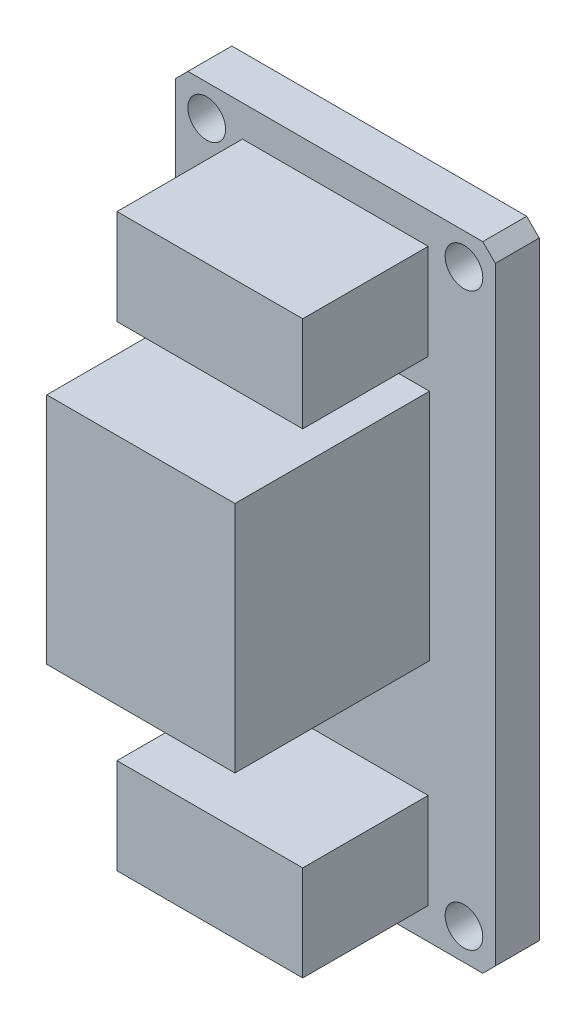
ISO-10303-21;
HEADER;
FILE_DESCRIPTION(('STEP AP214'),'2;1');
FILE_NAME('part.step','',(''),(''),'','','');
FILE_SCHEMA(('AUTOMOTIVE_DESIGN { 1 0 10303 214 1 1 1 1 }'));
ENDSEC;
DATA;
#1=APPLICATION_CONTEXT('core data for automotive mechanical design processes');
#2=APPLICATION_PROTOCOL_DEFINITION('international standard','automotive_design',2000,#1);
#3=PRODUCT_CONTEXT('',#1,'mechanical');
#4=PRODUCT('Part','Part','',(#3));
#5=PRODUCT_RELATED_PRODUCT_CATEGORY('part','',(#4));
#6=PRODUCT_DEFINITION_FORMATION('','',#4);
#7=PRODUCT_DEFINITION_CONTEXT('part definition',#1,'design');
#8=PRODUCT_DEFINITION('design','',#6,#7);
#9=PRODUCT_DEFINITION_SHAPE('','',#8);
#10=(LENGTH_UNIT() NAMED_UNIT(*) SI_UNIT(.MILLI.,.METRE.));
#11=(NAMED_UNIT(*) PLANE_ANGLE_UNIT() SI_UNIT($,.RADIAN.));
#12=(NAMED_UNIT(*) SI_UNIT($,.STERADIAN.) SOLID_ANGLE_UNIT());
#13=UNCERTAINTY_MEASURE_WITH_UNIT(LENGTH_MEASURE(1.E-05),#10,'distance_accuracy_value','');
#14=(GEOMETRIC_REPRESENTATION_CONTEXT(3) GLOBAL_UNCERTAINTY_ASSIGNED_CONTEXT((#13)) GLOBAL_UNIT_ASSIGNED_CONTEXT((#10,
#11,#12)) REPRESENTATION_CONTEXT('',''));
#15=CARTESIAN_POINT('',(0.,0.,0.));
#16=DIRECTION('',(0.,0.,1.));
#17=DIRECTION('',(1.,0.,0.));
#18=AXIS2_PLACEMENT_3D('',#15,#16,#17);
#19=CARTESIAN_POINT('',(0.,0.,0.));
#20=DIRECTION('',(0.,0.,1.));
#21=DIRECTION('',(1.,0.,0.));
#22=AXIS2_PLACEMENT_3D('',#19,#20,#21);
#23=PLANE('',#22);
#24=DIRECTION('',(-1.,0.,0.));
#25=VECTOR('',#24,1.);
#26=CARTESIAN_POINT('',(0.,2.5,0.));
#27=LINE('',#26,#25);
#28=CARTESIAN_POINT('',(20.15,2.5,0.));
#29=VERTEX_POINT('',#28);
#30=CARTESIAN_POINT('',(5.34999999999998,2.5,0.));
#31=VERTEX_POINT('',#30);
#32=EDGE_CURVE('E201',#29,#31,#27,.T.);
#33=ORIENTED_EDGE('',*,*,#32,.T.);
#34=DIRECTION('',(0.,1.,0.));
#35=VECTOR('',#34,1.);
#36=CARTESIAN_POINT('',(5.34999999999998,0.,0.));
#37=LINE('',#36,#35);
#38=CARTESIAN_POINT('',(5.34999999999998,10.1,0.));
#39=VERTEX_POINT('',#38);
#40=EDGE_CURVE('E213',#31,#39,#37,.T.);
#41=ORIENTED_EDGE('',*,*,#40,.T.);
#42=DIRECTION('',(1.,0.,0.));
#43=VECTOR('',#42,1.);
#44=CARTESIAN_POINT('',(0.,10.1,0.));
#45=LINE('',#44,#43);
#46=CARTESIAN_POINT('',(20.15,10.1,0.));
#47=VERTEX_POINT('',#46);
#48=EDGE_CURVE('E224',#39,#47,#45,.T.);
#49=ORIENTED_EDGE('',*,*,#48,.T.);
#50=DIRECTION('',(0.,-1.,0.));
#51=VECTOR('',#50,1.);
#52=CARTESIAN_POINT('',(20.15,0.,0.));
#53=LINE('',#52,#51);
#54=EDGE_CURVE('E203',#47,#29,#53,.T.);
#55=ORIENTED_EDGE('',*,*,#54,.T.);
#56=EDGE_LOOP('',(#33,#41,#49,#55));
#57=FACE_BOUND('',#56,.T.);
#58=CARTESIAN_POINT('',(2.5,2.5,0.));
#59=DIRECTION('',(0.,0.,1.));
#60=DIRECTION('',(1.,0.,0.));
#61=AXIS2_PLACEMENT_3D('',#58,#59,#60);
#62=CIRCLE('',#61,1.5);
#63=CARTESIAN_POINT('',(4.,2.5,0.));
#64=VERTEX_POINT('',#63);
#65=EDGE_CURVE('E267',#64,#64,#62,.F.);
#66=ORIENTED_EDGE('',*,*,#65,.T.);
#67=EDGE_LOOP('',(#66));
#68=FACE_BOUND('',#67,.T.);
#69=CARTESIAN_POINT('',(2.5,48.,0.));
#70=DIRECTION('',(0.,0.,1.));
#71=DIRECTION('',(1.,0.,0.));
#72=AXIS2_PLACEMENT_3D('',#69,#70,#71);
#73=CIRCLE('',#72,1.5);
#74=CARTESIAN_POINT('',(4.,48.,0.));
#75=VERTEX_POINT('',#74);
#76=EDGE_CURVE('E294',#75,#75,#73,.T.);
#77=ORIENTED_EDGE('',*,*,#76,.F.);
#78=EDGE_LOOP('',(#77));
#79=FACE_BOUND('',#78,.T.);
#80=DIRECTION('',(1.,0.,0.));
#81=VECTOR('',#80,1.);
#82=CARTESIAN_POINT('',(0.,0.,0.));
#83=LINE('',#82,#81);
#84=CARTESIAN_POINT('',(1.00000000000001,0.,0.));
#85=VERTEX_POINT('',#84);
#86=CARTESIAN_POINT('',(24.5,0.,0.));
#87=VERTEX_POINT('',#86);
#88=EDGE_CURVE('E297',#85,#87,#83,.T.);
#89=ORIENTED_EDGE('',*,*,#88,.T.);
#90=DIRECTION('',(-0.707106781186545,-0.70710678118655,0.));
#91=VECTOR('',#90,1.);
#92=CARTESIAN_POINT('',(12.2500000000001,-12.25,0.));
#93=LINE('',#92,#91);
#94=CARTESIAN_POINT('',(25.5,1.,0.));
#95=VERTEX_POINT('',#94);
#96=EDGE_CURVE('E323',#87,#95,#93,.F.);
#97=ORIENTED_EDGE('',*,*,#96,.T.);
#98=DIRECTION('',(0.,1.,0.));
#99=VECTOR('',#98,1.);
#100=CARTESIAN_POINT('',(25.5,0.,0.));
#101=LINE('',#100,#99);
#102=CARTESIAN_POINT('',(25.5,49.5,0.));
#103=VERTEX_POINT('',#102);
#104=EDGE_CURVE('E300',#95,#103,#101,.T.);
#105=ORIENTED_EDGE('',*,*,#104,.T.);
#106=DIRECTION('',(-0.707106781186552,0.707106781186543,0.));
#107=VECTOR('',#106,1.);
#108=CARTESIAN_POINT('',(37.4999999999998,37.5000000000003,0.));
#109=LINE('',#108,#107);
#110=CARTESIAN_POINT('',(24.5,50.5,0.));
#111=VERTEX_POINT('',#110);
#112=EDGE_CURVE('E319',#103,#111,#109,.T.);
#113=ORIENTED_EDGE('',*,*,#112,.T.);
#114=DIRECTION('',(1.,0.,0.));
#115=VECTOR('',#114,1.);
#116=CARTESIAN_POINT('',(0.,50.5,0.));
#117=LINE('',#116,#115);
#118=CARTESIAN_POINT('',(0.999999999999984,50.5,0.));
#119=VERTEX_POINT('',#118);
#120=EDGE_CURVE('E303',#119,#111,#117,.T.);
#121=ORIENTED_EDGE('',*,*,#120,.F.);
#122=DIRECTION('',(0.707106781186548,0.707106781186548,0.));
#123=VECTOR('',#122,1.);
#124=CARTESIAN_POINT('',(-24.75,24.75,0.));
#125=LINE('',#124,#123);
#126=CARTESIAN_POINT('',(0.,49.5,0.));
#127=VERTEX_POINT('',#126);
#128=EDGE_CURVE('E317',#119,#127,#125,.F.);
#129=ORIENTED_EDGE('',*,*,#128,.T.);
#130=DIRECTION('',(0.,1.,0.));
#131=VECTOR('',#130,1.);
#132=CARTESIAN_POINT('',(0.,0.,0.));
#133=LINE('',#132,#131);
#134=CARTESIAN_POINT('',(0.,1.,0.));
#135=VERTEX_POINT('',#134);
#136=EDGE_CURVE('E305',#135,#127,#133,.T.);
#137=ORIENTED_EDGE('',*,*,#136,.F.);
#138=DIRECTION('',(0.70710678118655,-0.707106781186545,0.));
#139=VECTOR('',#138,1.);
#140=CARTESIAN_POINT('',(0.5,0.500000000000004,0.));
#141=LINE('',#140,#139);
#142=EDGE_CURVE('E321',#135,#85,#141,.T.);
#143=ORIENTED_EDGE('',*,*,#142,.T.);
#144=EDGE_LOOP('',(#89,#97,#105,#113,#121,#129,#137,#143));
#145=FACE_BOUND('',#144,.T.);
#146=CARTESIAN_POINT('',(23.,2.5,0.));
#147=DIRECTION('',(0.,0.,1.));
#148=DIRECTION('',(1.,0.,0.));
#149=AXIS2_PLACEMENT_3D('',#146,#147,#148);
#150=CIRCLE('',#149,1.5);
#151=CARTESIAN_POINT('',(24.5,2.5,0.));
#152=VERTEX_POINT('',#151);
#153=EDGE_CURVE('E308',#152,#152,#150,.T.);
#154=ORIENTED_EDGE('',*,*,#153,.F.);
#155=EDGE_LOOP('',(#154));
#156=FACE_BOUND('',#155,.T.);
#157=CARTESIAN_POINT('',(23.,48.,0.));
#158=DIRECTION('',(0.,0.,1.));
#159=DIRECTION('',(1.,0.,0.));
#160=AXIS2_PLACEMENT_3D('',#157,#158,#159);
#161=CIRCLE('',#160,1.5);
#162=CARTESIAN_POINT('',(24.5,48.,0.));
#163=VERTEX_POINT('',#162);
#164=EDGE_CURVE('E272',#163,#163,#161,.F.);
#165=ORIENTED_EDGE('',*,*,#164,.T.);
#166=EDGE_LOOP('',(#165));
#167=FACE_BOUND('',#166,.T.);
#168=DIRECTION('',(0.,1.,0.));
#169=VECTOR('',#168,1.);
#170=CARTESIAN_POINT('',(20.15,0.,0.));
#171=LINE('',#170,#169);
#172=CARTESIAN_POINT('',(20.15,40.4,0.));
#173=VERTEX_POINT('',#172);
#174=CARTESIAN_POINT('',(20.15,48.,0.));
#175=VERTEX_POINT('',#174);
#176=EDGE_CURVE('E252',#173,#175,#171,.T.);
#177=ORIENTED_EDGE('',*,*,#176,.F.);
#178=DIRECTION('',(1.,0.,0.));
#179=VECTOR('',#178,1.);
#180=CARTESIAN_POINT('',(0.,40.4,0.));
#181=LINE('',#180,#179);
#182=CARTESIAN_POINT('',(5.34999999999998,40.4,0.));
#183=VERTEX_POINT('',#182);
#184=EDGE_CURVE('E238',#183,#173,#181,.T.);
#185=ORIENTED_EDGE('',*,*,#184,.F.);
#186=DIRECTION('',(0.,-1.,0.));
#187=VECTOR('',#186,1.);
#188=CARTESIAN_POINT('',(5.34999999999999,0.,0.));
#189=LINE('',#188,#187);
#190=CARTESIAN_POINT('',(5.34999999999998,48.,0.));
#191=VERTEX_POINT('',#190);
#192=EDGE_CURVE('E243',#191,#183,#189,.T.);
#193=ORIENTED_EDGE('',*,*,#192,.F.);
#194=DIRECTION('',(-1.,0.,0.));
#195=VECTOR('',#194,1.);
#196=CARTESIAN_POINT('',(0.,48.,0.));
#197=LINE('',#196,#195);
#198=EDGE_CURVE('E254',#175,#191,#197,.T.);
#199=ORIENTED_EDGE('',*,*,#198,.F.);
#200=EDGE_LOOP('',(#177,#185,#193,#199));
#201=FACE_BOUND('',#200,.T.);
#202=DIRECTION('',(0.,1.,0.));
#203=VECTOR('',#202,1.);
#204=CARTESIAN_POINT('',(20.25,0.,0.));
#205=LINE('',#204,#203);
#206=CARTESIAN_POINT('',(20.25,19.4485507803644,0.));
#207=VERTEX_POINT('',#206);
#208=CARTESIAN_POINT('',(20.25,38.0485507803644,0.));
#209=VERTEX_POINT('',#208);
#210=EDGE_CURVE('E733',#207,#209,#205,.T.);
#211=ORIENTED_EDGE('',*,*,#210,.F.);
#212=DIRECTION('',(1.,0.,0.));
#213=VECTOR('',#212,1.);
#214=CARTESIAN_POINT('',(0.,19.4485507803644,0.));
#215=LINE('',#214,#213);
#216=CARTESIAN_POINT('',(5.24999999999999,19.4485507803644,0.));
#217=VERTEX_POINT('',#216);
#218=EDGE_CURVE('E199',#217,#207,#215,.T.);
#219=ORIENTED_EDGE('',*,*,#218,.F.);
#220=DIRECTION('',(0.,-1.,0.));
#221=VECTOR('',#220,1.);
#222=CARTESIAN_POINT('',(5.24999999999999,0.,0.));
#223=LINE('',#222,#221);
#224=CARTESIAN_POINT('',(5.24999999999998,38.0485507803644,0.));
#225=VERTEX_POINT('',#224);
#226=EDGE_CURVE('E195',#225,#217,#223,.T.);
#227=ORIENTED_EDGE('',*,*,#226,.F.);
#228=DIRECTION('',(-1.,0.,0.));
#229=VECTOR('',#228,1.);
#230=CARTESIAN_POINT('',(0.,38.0485507803644,0.));
#231=LINE('',#230,#229);
#232=EDGE_CURVE('E736',#209,#225,#231,.T.);
#233=ORIENTED_EDGE('',*,*,#232,.F.);
#234=EDGE_LOOP('',(#211,#219,#227,#233));
#235=FACE_BOUND('',#234,.T.);
#236=ADVANCED_FACE('F38',(#57,#68,#79,#145,#156,#167,#201,#235),#23,.T.);
#237=CARTESIAN_POINT('',(0.,0.,-3.5));
#238=DIRECTION('',(0.,-1.,0.));
#239=DIRECTION('',(0.,0.,-1.));
#240=AXIS2_PLACEMENT_3D('',#237,#238,#239);
#241=PLANE('',#240);
#242=DIRECTION('',(1.,0.,0.));
#243=VECTOR('',#242,1.);
#244=CARTESIAN_POINT('',(0.,0.,-3.5));
#245=LINE('',#244,#243);
#246=CARTESIAN_POINT('',(1.00000000000001,0.,-3.5));
#247=VERTEX_POINT('',#246);
#248=CARTESIAN_POINT('',(24.5,0.,-3.5));
#249=VERTEX_POINT('',#248);
#250=EDGE_CURVE('E275',#247,#249,#245,.T.);
#251=ORIENTED_EDGE('',*,*,#250,.T.);
#252=DIRECTION('',(0.,0.,1.));
#253=VECTOR('',#252,1.);
#254=CARTESIAN_POINT('',(24.5,0.,-3.5));
#255=LINE('',#254,#253);
#256=EDGE_CURVE('E314',#249,#87,#255,.T.);
#257=ORIENTED_EDGE('',*,*,#256,.T.);
#258=ORIENTED_EDGE('',*,*,#88,.F.);
#259=DIRECTION('',(0.,0.,-1.));
#260=VECTOR('',#259,1.);
#261=CARTESIAN_POINT('',(1.00000000000001,0.,-3.5));
#262=LINE('',#261,#260);
#263=EDGE_CURVE('E291',#85,#247,#262,.T.);
#264=ORIENTED_EDGE('',*,*,#263,.T.);
#265=EDGE_LOOP('',(#251,#257,#258,#264));
#266=FACE_BOUND('',#265,.T.);
#267=ADVANCED_FACE('F367',(#266),#241,.T.);
#268=CARTESIAN_POINT('',(0.,0.,-3.5));
#269=DIRECTION('',(1.,0.,0.));
#270=DIRECTION('',(0.,1.,0.));
#271=AXIS2_PLACEMENT_3D('',#268,#269,#270);
#272=PLANE('',#271);
#273=DIRECTION('',(0.,1.,0.));
#274=VECTOR('',#273,1.);
#275=CARTESIAN_POINT('',(0.,0.,-3.5));
#276=LINE('',#275,#274);
#277=CARTESIAN_POINT('',(0.,1.,-3.5));
#278=VERTEX_POINT('',#277);
#279=CARTESIAN_POINT('',(0.,49.5,-3.5));
#280=VERTEX_POINT('',#279);
#281=EDGE_CURVE('E283',#278,#280,#276,.T.);
#282=ORIENTED_EDGE('',*,*,#281,.F.);
#283=DIRECTION('',(0.,0.,1.));
#284=VECTOR('',#283,1.);
#285=CARTESIAN_POINT('',(0.,1.,0.));
#286=LINE('',#285,#284);
#287=EDGE_CURVE('E339',#278,#135,#286,.T.);
#288=ORIENTED_EDGE('',*,*,#287,.T.);
#289=ORIENTED_EDGE('',*,*,#136,.T.);
#290=DIRECTION('',(0.,0.,-1.));
#291=VECTOR('',#290,1.);
#292=CARTESIAN_POINT('',(0.,49.5,-3.5));
#293=LINE('',#292,#291);
#294=EDGE_CURVE('E337',#127,#280,#293,.T.);
#295=ORIENTED_EDGE('',*,*,#294,.T.);
#296=EDGE_LOOP('',(#282,#288,#289,#295));
#297=FACE_BOUND('',#296,.T.);
#298=ADVANCED_FACE('F375',(#297),#272,.F.);
#299=CARTESIAN_POINT('',(0.,50.5,-3.5));
#300=DIRECTION('',(0.,-1.,0.));
#301=DIRECTION('',(0.,0.,-1.));
#302=AXIS2_PLACEMENT_3D('',#299,#300,#301);
#303=PLANE('',#302);
#304=ORIENTED_EDGE('',*,*,#120,.T.);
#305=DIRECTION('',(0.,0.,-1.));
#306=VECTOR('',#305,1.);
#307=CARTESIAN_POINT('',(24.5,50.5,-3.5));
#308=LINE('',#307,#306);
#309=CARTESIAN_POINT('',(24.5,50.5,-3.5));
#310=VERTEX_POINT('',#309);
#311=EDGE_CURVE('E11',#111,#310,#308,.T.);
#312=ORIENTED_EDGE('',*,*,#311,.T.);
#313=DIRECTION('',(1.,0.,0.));
#314=VECTOR('',#313,1.);
#315=CARTESIAN_POINT('',(0.,50.5,-3.5));
#316=LINE('',#315,#314);
#317=CARTESIAN_POINT('',(0.999999999999984,50.5,-3.5));
#318=VERTEX_POINT('',#317);
#319=EDGE_CURVE('E281',#318,#310,#316,.T.);
#320=ORIENTED_EDGE('',*,*,#319,.F.);
#321=DIRECTION('',(0.,0.,1.));
#322=VECTOR('',#321,1.);
#323=CARTESIAN_POINT('',(0.999999999999984,50.5,-3.5));
#324=LINE('',#323,#322);
#325=EDGE_CURVE('E47',#318,#119,#324,.T.);
#326=ORIENTED_EDGE('',*,*,#325,.T.);
#327=EDGE_LOOP('',(#304,#312,#320,#326));
#328=FACE_BOUND('',#327,.T.);
#329=ADVANCED_FACE('F344',(#328),#303,.F.);
#330=CARTESIAN_POINT('',(23.,2.5,-3.5));
#331=DIRECTION('',(0.,0.,1.));
#332=DIRECTION('',(1.,0.,0.));
#333=AXIS2_PLACEMENT_3D('',#330,#331,#332);
#334=CYLINDRICAL_SURFACE('',#333,1.5);
#335=CARTESIAN_POINT('',(23.,2.5,-3.5));
#336=DIRECTION('',(0.,0.,1.));
#337=DIRECTION('',(1.,0.,0.));
#338=AXIS2_PLACEMENT_3D('',#335,#336,#337);
#339=CIRCLE('',#338,1.5);
#340=CARTESIAN_POINT('',(24.5,2.5,-3.5));
#341=VERTEX_POINT('',#340);
#342=EDGE_CURVE('E285',#341,#341,#339,.T.);
#343=ORIENTED_EDGE('',*,*,#342,.F.);
#344=EDGE_LOOP('',(#343));
#345=FACE_BOUND('',#344,.T.);
#346=ORIENTED_EDGE('',*,*,#153,.T.);
#347=EDGE_LOOP('',(#346));
#348=FACE_BOUND('',#347,.T.);
#349=ADVANCED_FACE('F397',(#345,#348),#334,.F.);
#350=CARTESIAN_POINT('',(25.5,0.,-3.5));
#351=DIRECTION('',(1.,0.,0.));
#352=DIRECTION('',(0.,1.,0.));
#353=AXIS2_PLACEMENT_3D('',#350,#351,#352);
#354=PLANE('',#353);
#355=ORIENTED_EDGE('',*,*,#104,.F.);
#356=DIRECTION('',(0.,0.,-1.));
#357=VECTOR('',#356,1.);
#358=CARTESIAN_POINT('',(25.5,1.,-3.5));
#359=LINE('',#358,#357);
#360=CARTESIAN_POINT('',(25.5,1.,-3.5));
#361=VERTEX_POINT('',#360);
#362=EDGE_CURVE('E328',#95,#361,#359,.T.);
#363=ORIENTED_EDGE('',*,*,#362,.T.);
#364=DIRECTION('',(0.,1.,0.));
#365=VECTOR('',#364,1.);
#366=CARTESIAN_POINT('',(25.5,0.,-3.5));
#367=LINE('',#366,#365);
#368=CARTESIAN_POINT('',(25.5,49.5,-3.5));
#369=VERTEX_POINT('',#368);
#370=EDGE_CURVE('E278',#361,#369,#367,.T.);
#371=ORIENTED_EDGE('',*,*,#370,.T.);
#372=DIRECTION('',(0.,0.,1.));
#373=VECTOR('',#372,1.);
#374=CARTESIAN_POINT('',(25.5,49.5,0.));
#375=LINE('',#374,#373);
#376=EDGE_CURVE('E325',#369,#103,#375,.T.);
#377=ORIENTED_EDGE('',*,*,#376,.T.);
#378=EDGE_LOOP('',(#355,#363,#371,#377));
#379=FACE_BOUND('',#378,.T.);
#380=ADVANCED_FACE('F355',(#379),#354,.T.);
#381=CARTESIAN_POINT('',(2.5,48.,-3.5));
#382=DIRECTION('',(0.,0.,1.));
#383=DIRECTION('',(1.,0.,0.));
#384=AXIS2_PLACEMENT_3D('',#381,#382,#383);
#385=CYLINDRICAL_SURFACE('',#384,1.5);
#386=CARTESIAN_POINT('',(2.5,48.,-3.5));
#387=DIRECTION('',(0.,0.,1.));
#388=DIRECTION('',(1.,0.,0.));
#389=AXIS2_PLACEMENT_3D('',#386,#387,#388);
#390=CIRCLE('',#389,1.5);
#391=CARTESIAN_POINT('',(4.,48.,-3.5));
#392=VERTEX_POINT('',#391);
#393=EDGE_CURVE('E271',#392,#392,#390,.T.);
#394=ORIENTED_EDGE('',*,*,#393,.F.);
#395=EDGE_LOOP('',(#394));
#396=FACE_BOUND('',#395,.T.);
#397=ORIENTED_EDGE('',*,*,#76,.T.);
#398=EDGE_LOOP('',(#397));
#399=FACE_BOUND('',#398,.T.);
#400=ADVANCED_FACE('F406',(#396,#399),#385,.F.);
#401=CARTESIAN_POINT('',(2.5,2.5,-3.5));
#402=DIRECTION('',(0.,0.,1.));
#403=DIRECTION('',(1.,0.,0.));
#404=AXIS2_PLACEMENT_3D('',#401,#402,#403);
#405=CYLINDRICAL_SURFACE('',#404,1.5);
#406=CARTESIAN_POINT('',(2.5,2.5,-3.5));
#407=DIRECTION('',(0.,0.,1.));
#408=DIRECTION('',(1.,0.,0.));
#409=AXIS2_PLACEMENT_3D('',#406,#407,#408);
#410=CIRCLE('',#409,1.5);
#411=CARTESIAN_POINT('',(4.,2.5,-3.5));
#412=VERTEX_POINT('',#411);
#413=EDGE_CURVE('E268',#412,#412,#410,.F.);
#414=ORIENTED_EDGE('',*,*,#413,.T.);
#415=EDGE_LOOP('',(#414));
#416=FACE_BOUND('',#415,.T.);
#417=ORIENTED_EDGE('',*,*,#65,.F.);
#418=EDGE_LOOP('',(#417));
#419=FACE_BOUND('',#418,.T.);
#420=ADVANCED_FACE('F395',(#416,#419),#405,.F.);
#421=CARTESIAN_POINT('',(23.,48.,-3.5));
#422=DIRECTION('',(0.,0.,1.));
#423=DIRECTION('',(1.,0.,0.));
#424=AXIS2_PLACEMENT_3D('',#421,#422,#423);
#425=CYLINDRICAL_SURFACE('',#424,1.5);
#426=CARTESIAN_POINT('',(23.,48.,-3.5));
#427=DIRECTION('',(0.,0.,1.));
#428=DIRECTION('',(1.,0.,0.));
#429=AXIS2_PLACEMENT_3D('',#426,#427,#428);
#430=CIRCLE('',#429,1.5);
#431=CARTESIAN_POINT('',(24.5,48.,-3.5));
#432=VERTEX_POINT('',#431);
#433=EDGE_CURVE('E288',#432,#432,#430,.F.);
#434=ORIENTED_EDGE('',*,*,#433,.T.);
#435=EDGE_LOOP('',(#434));
#436=FACE_BOUND('',#435,.T.);
#437=ORIENTED_EDGE('',*,*,#164,.F.);
#438=EDGE_LOOP('',(#437));
#439=FACE_BOUND('',#438,.T.);
#440=ADVANCED_FACE('F392',(#436,#439),#425,.F.);
#441=CARTESIAN_POINT('',(0.,0.,-3.5));
#442=DIRECTION('',(0.,0.,1.));
#443=DIRECTION('',(1.,0.,0.));
#444=AXIS2_PLACEMENT_3D('',#441,#442,#443);
#445=PLANE('',#444);
#446=ORIENTED_EDGE('',*,*,#413,.F.);
#447=EDGE_LOOP('',(#446));
#448=FACE_BOUND('',#447,.T.);
#449=ORIENTED_EDGE('',*,*,#393,.T.);
#450=EDGE_LOOP('',(#449));
#451=FACE_BOUND('',#450,.T.);
#452=ORIENTED_EDGE('',*,*,#370,.F.);
#453=DIRECTION('',(0.707106781186545,0.70710678118655,0.));
#454=VECTOR('',#453,1.);
#455=CARTESIAN_POINT('',(24.5,0.,-3.5));
#456=LINE('',#455,#454);
#457=EDGE_CURVE('E335',#361,#249,#456,.F.);
#458=ORIENTED_EDGE('',*,*,#457,.T.);
#459=ORIENTED_EDGE('',*,*,#250,.F.);
#460=DIRECTION('',(-0.70710678118655,0.707106781186545,0.));
#461=VECTOR('',#460,1.);
#462=CARTESIAN_POINT('',(0.,1.,-3.5));
#463=LINE('',#462,#461);
#464=EDGE_CURVE('E333',#247,#278,#463,.T.);
#465=ORIENTED_EDGE('',*,*,#464,.T.);
#466=ORIENTED_EDGE('',*,*,#281,.T.);
#467=DIRECTION('',(-0.707106781186548,-0.707106781186548,0.));
#468=VECTOR('',#467,1.);
#469=CARTESIAN_POINT('',(0.999999999999984,50.5,-3.5));
#470=LINE('',#469,#468);
#471=EDGE_CURVE('E59',#280,#318,#470,.F.);
#472=ORIENTED_EDGE('',*,*,#471,.T.);
#473=ORIENTED_EDGE('',*,*,#319,.T.);
#474=DIRECTION('',(0.707106781186552,-0.707106781186543,0.));
#475=VECTOR('',#474,1.);
#476=CARTESIAN_POINT('',(25.5,49.5,-3.5));
#477=LINE('',#476,#475);
#478=EDGE_CURVE('E331',#310,#369,#477,.T.);
#479=ORIENTED_EDGE('',*,*,#478,.T.);
#480=EDGE_LOOP('',(#452,#458,#459,#465,#466,#472,#473,#479));
#481=FACE_BOUND('',#480,.T.);
#482=ORIENTED_EDGE('',*,*,#342,.T.);
#483=EDGE_LOOP('',(#482));
#484=FACE_BOUND('',#483,.T.);
#485=ORIENTED_EDGE('',*,*,#433,.F.);
#486=EDGE_LOOP('',(#485));
#487=FACE_BOUND('',#486,.T.);
#488=ADVANCED_FACE('F359',(#448,#451,#481,#484,#487),#445,.F.);
#489=CARTESIAN_POINT('',(0.,40.4,10.));
#490=DIRECTION('',(0.,1.,0.));
#491=DIRECTION('',(0.,0.,1.));
#492=AXIS2_PLACEMENT_3D('',#489,#490,#491);
#493=PLANE('',#492);
#494=ORIENTED_EDGE('',*,*,#184,.T.);
#495=DIRECTION('',(0.,0.,-1.));
#496=VECTOR('',#495,1.);
#497=CARTESIAN_POINT('',(20.15,40.4,10.));
#498=LINE('',#497,#496);
#499=CARTESIAN_POINT('',(20.15,40.4,10.));
#500=VERTEX_POINT('',#499);
#501=EDGE_CURVE('E265',#500,#173,#498,.T.);
#502=ORIENTED_EDGE('',*,*,#501,.F.);
#503=DIRECTION('',(1.,0.,0.));
#504=VECTOR('',#503,1.);
#505=CARTESIAN_POINT('',(0.,40.4,10.));
#506=LINE('',#505,#504);
#507=CARTESIAN_POINT('',(5.34999999999998,40.4,10.));
#508=VERTEX_POINT('',#507);
#509=EDGE_CURVE('E239',#508,#500,#506,.T.);
#510=ORIENTED_EDGE('',*,*,#509,.F.);
#511=DIRECTION('',(0.,0.,-1.));
#512=VECTOR('',#511,1.);
#513=CARTESIAN_POINT('',(5.34999999999998,40.4,10.));
#514=LINE('',#513,#512);
#515=EDGE_CURVE('E249',#508,#183,#514,.T.);
#516=ORIENTED_EDGE('',*,*,#515,.T.);
#517=EDGE_LOOP('',(#494,#502,#510,#516));
#518=FACE_BOUND('',#517,.T.);
#519=ADVANCED_FACE('F592',(#518),#493,.F.);
#520=CARTESIAN_POINT('',(20.15,0.,10.));
#521=DIRECTION('',(-1.,0.,0.));
#522=DIRECTION('',(0.,0.,1.));
#523=AXIS2_PLACEMENT_3D('',#520,#521,#522);
#524=PLANE('',#523);
#525=ORIENTED_EDGE('',*,*,#176,.T.);
#526=DIRECTION('',(0.,0.,-1.));
#527=VECTOR('',#526,1.);
#528=CARTESIAN_POINT('',(20.15,48.,10.));
#529=LINE('',#528,#527);
#530=CARTESIAN_POINT('',(20.15,48.,10.));
#531=VERTEX_POINT('',#530);
#532=EDGE_CURVE('E262',#531,#175,#529,.T.);
#533=ORIENTED_EDGE('',*,*,#532,.F.);
#534=DIRECTION('',(0.,1.,0.));
#535=VECTOR('',#534,1.);
#536=CARTESIAN_POINT('',(20.15,0.,10.));
#537=LINE('',#536,#535);
#538=EDGE_CURVE('E242',#500,#531,#537,.T.);
#539=ORIENTED_EDGE('',*,*,#538,.F.);
#540=ORIENTED_EDGE('',*,*,#501,.T.);
#541=EDGE_LOOP('',(#525,#533,#539,#540));
#542=FACE_BOUND('',#541,.T.);
#543=ADVANCED_FACE('F582',(#542),#524,.F.);
#544=CARTESIAN_POINT('',(0.,48.,10.));
#545=DIRECTION('',(0.,-1.,0.));
#546=DIRECTION('',(0.,0.,-1.));
#547=AXIS2_PLACEMENT_3D('',#544,#545,#546);
#548=PLANE('',#547);
#549=ORIENTED_EDGE('',*,*,#198,.T.);
#550=DIRECTION('',(0.,0.,-1.));
#551=VECTOR('',#550,1.);
#552=CARTESIAN_POINT('',(5.34999999999998,48.,10.));
#553=LINE('',#552,#551);
#554=CARTESIAN_POINT('',(5.34999999999998,48.,10.));
#555=VERTEX_POINT('',#554);
#556=EDGE_CURVE('E260',#555,#191,#553,.T.);
#557=ORIENTED_EDGE('',*,*,#556,.F.);
#558=DIRECTION('',(-1.,0.,0.));
#559=VECTOR('',#558,1.);
#560=CARTESIAN_POINT('',(0.,48.,10.));
#561=LINE('',#560,#559);
#562=EDGE_CURVE('E245',#531,#555,#561,.T.);
#563=ORIENTED_EDGE('',*,*,#562,.F.);
#564=ORIENTED_EDGE('',*,*,#532,.T.);
#565=EDGE_LOOP('',(#549,#557,#563,#564));
#566=FACE_BOUND('',#565,.T.);
#567=ADVANCED_FACE('F572',(#566),#548,.F.);
#568=CARTESIAN_POINT('',(5.34999999999999,0.,10.));
#569=DIRECTION('',(1.,0.,0.));
#570=DIRECTION('',(0.,1.,0.));
#571=AXIS2_PLACEMENT_3D('',#568,#569,#570);
#572=PLANE('',#571);
#573=ORIENTED_EDGE('',*,*,#192,.T.);
#574=ORIENTED_EDGE('',*,*,#515,.F.);
#575=DIRECTION('',(0.,-1.,0.));
#576=VECTOR('',#575,1.);
#577=CARTESIAN_POINT('',(5.34999999999999,0.,10.));
#578=LINE('',#577,#576);
#579=EDGE_CURVE('E247',#555,#508,#578,.T.);
#580=ORIENTED_EDGE('',*,*,#579,.F.);
#581=ORIENTED_EDGE('',*,*,#556,.T.);
#582=EDGE_LOOP('',(#573,#574,#580,#581));
#583=FACE_BOUND('',#582,.T.);
#584=ADVANCED_FACE('F562',(#583),#572,.F.);
#585=CARTESIAN_POINT('',(0.,0.,10.));
#586=DIRECTION('',(0.,0.,1.));
#587=DIRECTION('',(1.,0.,0.));
#588=AXIS2_PLACEMENT_3D('',#585,#586,#587);
#589=PLANE('',#588);
#590=ORIENTED_EDGE('',*,*,#509,.T.);
#591=ORIENTED_EDGE('',*,*,#538,.T.);
#592=ORIENTED_EDGE('',*,*,#562,.T.);
#593=ORIENTED_EDGE('',*,*,#579,.T.);
#594=EDGE_LOOP('',(#590,#591,#592,#593));
#595=FACE_BOUND('',#594,.T.);
#596=ADVANCED_FACE('F552',(#595),#589,.T.);
#597=CARTESIAN_POINT('',(0.,2.5,10.));
#598=DIRECTION('',(0.,-1.,0.));
#599=DIRECTION('',(0.,0.,-1.));
#600=AXIS2_PLACEMENT_3D('',#597,#598,#599);
#601=PLANE('',#600);
#602=ORIENTED_EDGE('',*,*,#32,.F.);
#603=DIRECTION('',(0.,0.,-1.));
#604=VECTOR('',#603,1.);
#605=CARTESIAN_POINT('',(20.15,2.5,10.));
#606=LINE('',#605,#604);
#607=CARTESIAN_POINT('',(20.15,2.5,10.));
#608=VERTEX_POINT('',#607);
#609=EDGE_CURVE('E235',#608,#29,#606,.T.);
#610=ORIENTED_EDGE('',*,*,#609,.F.);
#611=DIRECTION('',(-1.,0.,0.));
#612=VECTOR('',#611,1.);
#613=CARTESIAN_POINT('',(0.,2.5,10.));
#614=LINE('',#613,#612);
#615=CARTESIAN_POINT('',(5.34999999999998,2.5,10.));
#616=VERTEX_POINT('',#615);
#617=EDGE_CURVE('E209',#608,#616,#614,.T.);
#618=ORIENTED_EDGE('',*,*,#617,.T.);
#619=DIRECTION('',(0.,0.,-1.));
#620=VECTOR('',#619,1.);
#621=CARTESIAN_POINT('',(5.34999999999998,2.5,10.));
#622=LINE('',#621,#620);
#623=EDGE_CURVE('E221',#616,#31,#622,.T.);
#624=ORIENTED_EDGE('',*,*,#623,.T.);
#625=EDGE_LOOP('',(#602,#610,#618,#624));
#626=FACE_BOUND('',#625,.T.);
#627=ADVANCED_FACE('F542',(#626),#601,.T.);
#628=CARTESIAN_POINT('',(20.15,0.,10.));
#629=DIRECTION('',(1.,0.,0.));
#630=DIRECTION('',(0.,0.,-1.));
#631=AXIS2_PLACEMENT_3D('',#628,#629,#630);
#632=PLANE('',#631);
#633=ORIENTED_EDGE('',*,*,#54,.F.);
#634=DIRECTION('',(0.,0.,-1.));
#635=VECTOR('',#634,1.);
#636=CARTESIAN_POINT('',(20.15,10.1,10.));
#637=LINE('',#636,#635);
#638=CARTESIAN_POINT('',(20.15,10.1,10.));
#639=VERTEX_POINT('',#638);
#640=EDGE_CURVE('E232',#639,#47,#637,.T.);
#641=ORIENTED_EDGE('',*,*,#640,.F.);
#642=DIRECTION('',(0.,-1.,0.));
#643=VECTOR('',#642,1.);
#644=CARTESIAN_POINT('',(20.15,0.,10.));
#645=LINE('',#644,#643);
#646=EDGE_CURVE('E212',#639,#608,#645,.T.);
#647=ORIENTED_EDGE('',*,*,#646,.T.);
#648=ORIENTED_EDGE('',*,*,#609,.T.);
#649=EDGE_LOOP('',(#633,#641,#647,#648));
#650=FACE_BOUND('',#649,.T.);
#651=ADVANCED_FACE('F532',(#650),#632,.T.);
#652=CARTESIAN_POINT('',(0.,10.1,10.));
#653=DIRECTION('',(0.,1.,0.));
#654=DIRECTION('',(0.,0.,1.));
#655=AXIS2_PLACEMENT_3D('',#652,#653,#654);
#656=PLANE('',#655);
#657=ORIENTED_EDGE('',*,*,#48,.F.);
#658=DIRECTION('',(0.,0.,-1.));
#659=VECTOR('',#658,1.);
#660=CARTESIAN_POINT('',(5.34999999999998,10.1,10.));
#661=LINE('',#660,#659);
#662=CARTESIAN_POINT('',(5.34999999999998,10.1,10.));
#663=VERTEX_POINT('',#662);
#664=EDGE_CURVE('E229',#663,#39,#661,.T.);
#665=ORIENTED_EDGE('',*,*,#664,.F.);
#666=DIRECTION('',(1.,0.,0.));
#667=VECTOR('',#666,1.);
#668=CARTESIAN_POINT('',(0.,10.1,10.));
#669=LINE('',#668,#667);
#670=EDGE_CURVE('E216',#663,#639,#669,.T.);
#671=ORIENTED_EDGE('',*,*,#670,.T.);
#672=ORIENTED_EDGE('',*,*,#640,.T.);
#673=EDGE_LOOP('',(#657,#665,#671,#672));
#674=FACE_BOUND('',#673,.T.);
#675=ADVANCED_FACE('F522',(#674),#656,.T.);
#676=CARTESIAN_POINT('',(5.34999999999998,0.,10.));
#677=DIRECTION('',(-1.,0.,0.));
#678=DIRECTION('',(0.,-1.,0.));
#679=AXIS2_PLACEMENT_3D('',#676,#677,#678);
#680=PLANE('',#679);
#681=ORIENTED_EDGE('',*,*,#40,.F.);
#682=ORIENTED_EDGE('',*,*,#623,.F.);
#683=DIRECTION('',(0.,1.,0.));
#684=VECTOR('',#683,1.);
#685=CARTESIAN_POINT('',(5.34999999999998,0.,10.));
#686=LINE('',#685,#684);
#687=EDGE_CURVE('E219',#616,#663,#686,.T.);
#688=ORIENTED_EDGE('',*,*,#687,.T.);
#689=ORIENTED_EDGE('',*,*,#664,.T.);
#690=EDGE_LOOP('',(#681,#682,#688,#689));
#691=FACE_BOUND('',#690,.T.);
#692=ADVANCED_FACE('F512',(#691),#680,.T.);
#693=CARTESIAN_POINT('',(0.,0.,10.));
#694=DIRECTION('',(0.,0.,1.));
#695=DIRECTION('',(1.,0.,0.));
#696=AXIS2_PLACEMENT_3D('',#693,#694,#695);
#697=PLANE('',#696);
#698=ORIENTED_EDGE('',*,*,#617,.F.);
#699=ORIENTED_EDGE('',*,*,#646,.F.);
#700=ORIENTED_EDGE('',*,*,#670,.F.);
#701=ORIENTED_EDGE('',*,*,#687,.F.);
#702=EDGE_LOOP('',(#698,#699,#700,#701));
#703=FACE_BOUND('',#702,.T.);
#704=ADVANCED_FACE('F498',(#703),#697,.T.);
#705=CARTESIAN_POINT('',(0.,19.4485507803644,15.5));
#706=DIRECTION('',(0.,1.,0.));
#707=DIRECTION('',(-1.,0.,0.));
#708=AXIS2_PLACEMENT_3D('',#705,#706,#707);
#709=PLANE('',#708);
#710=ORIENTED_EDGE('',*,*,#218,.T.);
#711=DIRECTION('',(0.,0.,-1.));
#712=VECTOR('',#711,1.);
#713=CARTESIAN_POINT('',(20.25,19.4485507803644,15.5));
#714=LINE('',#713,#712);
#715=CARTESIAN_POINT('',(20.25,19.4485507803644,15.5));
#716=VERTEX_POINT('',#715);
#717=EDGE_CURVE('E179',#716,#207,#714,.T.);
#718=ORIENTED_EDGE('',*,*,#717,.F.);
#719=DIRECTION('',(1.,0.,0.));
#720=VECTOR('',#719,1.);
#721=CARTESIAN_POINT('',(0.,19.4485507803644,15.5));
#722=LINE('',#721,#720);
#723=CARTESIAN_POINT('',(5.24999999999999,19.4485507803644,15.5));
#724=VERTEX_POINT('',#723);
#725=EDGE_CURVE('E186',#724,#716,#722,.T.);
#726=ORIENTED_EDGE('',*,*,#725,.F.);
#727=DIRECTION('',(0.,0.,-1.));
#728=VECTOR('',#727,1.);
#729=CARTESIAN_POINT('',(5.24999999999999,19.4485507803644,15.5));
#730=LINE('',#729,#728);
#731=EDGE_CURVE('E743',#724,#217,#730,.T.);
#732=ORIENTED_EDGE('',*,*,#731,.T.);
#733=EDGE_LOOP('',(#710,#718,#726,#732));
#734=FACE_BOUND('',#733,.T.);
#735=ADVANCED_FACE('F197',(#734),#709,.F.);
#736=CARTESIAN_POINT('',(20.25,0.,15.5));
#737=DIRECTION('',(-1.,0.,0.));
#738=DIRECTION('',(0.,0.,1.));
#739=AXIS2_PLACEMENT_3D('',#736,#737,#738);
#740=PLANE('',#739);
#741=ORIENTED_EDGE('',*,*,#210,.T.);
#742=DIRECTION('',(0.,0.,-1.));
#743=VECTOR('',#742,1.);
#744=CARTESIAN_POINT('',(20.25,38.0485507803644,15.5));
#745=LINE('',#744,#743);
#746=CARTESIAN_POINT('',(20.25,38.0485507803644,15.5));
#747=VERTEX_POINT('',#746);
#748=EDGE_CURVE('E182',#747,#209,#745,.T.);
#749=ORIENTED_EDGE('',*,*,#748,.F.);
#750=DIRECTION('',(0.,1.,0.));
#751=VECTOR('',#750,1.);
#752=CARTESIAN_POINT('',(20.25,0.,15.5));
#753=LINE('',#752,#751);
#754=EDGE_CURVE('E175',#716,#747,#753,.T.);
#755=ORIENTED_EDGE('',*,*,#754,.F.);
#756=ORIENTED_EDGE('',*,*,#717,.T.);
#757=EDGE_LOOP('',(#741,#749,#755,#756));
#758=FACE_BOUND('',#757,.T.);
#759=ADVANCED_FACE('F177',(#758),#740,.F.);
#760=CARTESIAN_POINT('',(0.,38.0485507803644,15.5));
#761=DIRECTION('',(0.,-1.,0.));
#762=DIRECTION('',(0.,0.,-1.));
#763=AXIS2_PLACEMENT_3D('',#760,#761,#762);
#764=PLANE('',#763);
#765=ORIENTED_EDGE('',*,*,#232,.T.);
#766=DIRECTION('',(0.,0.,-1.));
#767=VECTOR('',#766,1.);
#768=CARTESIAN_POINT('',(5.24999999999998,38.0485507803644,15.5));
#769=LINE('',#768,#767);
#770=CARTESIAN_POINT('',(5.24999999999998,38.0485507803644,15.5));
#771=VERTEX_POINT('',#770);
#772=EDGE_CURVE('E205',#771,#225,#769,.T.);
#773=ORIENTED_EDGE('',*,*,#772,.F.);
#774=DIRECTION('',(-1.,0.,0.));
#775=VECTOR('',#774,1.);
#776=CARTESIAN_POINT('',(0.,38.0485507803644,15.5));
#777=LINE('',#776,#775);
#778=EDGE_CURVE('E185',#747,#771,#777,.T.);
#779=ORIENTED_EDGE('',*,*,#778,.F.);
#780=ORIENTED_EDGE('',*,*,#748,.T.);
#781=EDGE_LOOP('',(#765,#773,#779,#780));
#782=FACE_BOUND('',#781,.T.);
#783=ADVANCED_FACE('F471',(#782),#764,.F.);
#784=CARTESIAN_POINT('',(5.24999999999999,0.,15.5));
#785=DIRECTION('',(1.,0.,0.));
#786=DIRECTION('',(0.,1.,0.));
#787=AXIS2_PLACEMENT_3D('',#784,#785,#786);
#788=PLANE('',#787);
#789=ORIENTED_EDGE('',*,*,#226,.T.);
#790=ORIENTED_EDGE('',*,*,#731,.F.);
#791=DIRECTION('',(0.,-1.,0.));
#792=VECTOR('',#791,1.);
#793=CARTESIAN_POINT('',(5.24999999999999,0.,15.5));
#794=LINE('',#793,#792);
#795=EDGE_CURVE('E191',#771,#724,#794,.T.);
#796=ORIENTED_EDGE('',*,*,#795,.F.);
#797=ORIENTED_EDGE('',*,*,#772,.T.);
#798=EDGE_LOOP('',(#789,#790,#796,#797));
#799=FACE_BOUND('',#798,.T.);
#800=ADVANCED_FACE('F462',(#799),#788,.F.);
#801=CARTESIAN_POINT('',(0.,0.,15.5));
#802=DIRECTION('',(0.,0.,1.));
#803=DIRECTION('',(1.,0.,0.));
#804=AXIS2_PLACEMENT_3D('',#801,#802,#803);
#805=PLANE('',#804);
#806=ORIENTED_EDGE('',*,*,#725,.T.);
#807=ORIENTED_EDGE('',*,*,#754,.T.);
#808=ORIENTED_EDGE('',*,*,#778,.T.);
#809=ORIENTED_EDGE('',*,*,#795,.T.);
#810=EDGE_LOOP('',(#806,#807,#808,#809));
#811=FACE_BOUND('',#810,.T.);
#812=ADVANCED_FACE('F189',(#811),#805,.T.);
#813=CARTESIAN_POINT('',(24.5,0.,-3.5));
#814=DIRECTION('',(-0.70710678118655,0.707106781186545,0.));
#815=DIRECTION('',(0.,0.,1.));
#816=AXIS2_PLACEMENT_3D('',#813,#814,#815);
#817=PLANE('',#816);
#818=ORIENTED_EDGE('',*,*,#457,.F.);
#819=ORIENTED_EDGE('',*,*,#362,.F.);
#820=ORIENTED_EDGE('',*,*,#96,.F.);
#821=ORIENTED_EDGE('',*,*,#256,.F.);
#822=EDGE_LOOP('',(#818,#819,#820,#821));
#823=FACE_BOUND('',#822,.T.);
#824=ADVANCED_FACE('F364',(#823),#817,.F.);
#825=CARTESIAN_POINT('',(0.,1.,-3.5));
#826=DIRECTION('',(-0.707106781186545,-0.70710678118655,0.));
#827=DIRECTION('',(0.,0.,-1.));
#828=AXIS2_PLACEMENT_3D('',#825,#826,#827);
#829=PLANE('',#828);
#830=ORIENTED_EDGE('',*,*,#464,.F.);
#831=ORIENTED_EDGE('',*,*,#263,.F.);
#832=ORIENTED_EDGE('',*,*,#142,.F.);
#833=ORIENTED_EDGE('',*,*,#287,.F.);
#834=EDGE_LOOP('',(#830,#831,#832,#833));
#835=FACE_BOUND('',#834,.T.);
#836=ADVANCED_FACE('F372',(#835),#829,.T.);
#837=CARTESIAN_POINT('',(25.5,49.5,-3.5));
#838=DIRECTION('',(0.707106781186543,0.707106781186552,0.));
#839=DIRECTION('',(0.,0.,-1.));
#840=AXIS2_PLACEMENT_3D('',#837,#838,#839);
#841=PLANE('',#840);
#842=ORIENTED_EDGE('',*,*,#478,.F.);
#843=ORIENTED_EDGE('',*,*,#311,.F.);
#844=ORIENTED_EDGE('',*,*,#112,.F.);
#845=ORIENTED_EDGE('',*,*,#376,.F.);
#846=EDGE_LOOP('',(#842,#843,#844,#845));
#847=FACE_BOUND('',#846,.T.);
#848=ADVANCED_FACE('F353',(#847),#841,.T.);
#849=CARTESIAN_POINT('',(0.999999999999984,50.5,-3.5));
#850=DIRECTION('',(0.707106781186547,-0.707106781186547,0.));
#851=DIRECTION('',(0.,0.,1.));
#852=AXIS2_PLACEMENT_3D('',#849,#850,#851);
#853=PLANE('',#852);
#854=ORIENTED_EDGE('',*,*,#471,.F.);
#855=ORIENTED_EDGE('',*,*,#294,.F.);
#856=ORIENTED_EDGE('',*,*,#128,.F.);
#857=ORIENTED_EDGE('',*,*,#325,.F.);
#858=EDGE_LOOP('',(#854,#855,#856,#857));
#859=FACE_BOUND('',#858,.T.);
#860=ADVANCED_FACE('F41',(#859),#853,.F.);
#861=CLOSED_SHELL('',(#236,#267,#298,#329,#349,#380,#400,#420,#440,#488,#519,#543,#567,#584,
#596,#627,#651,#675,#692,#704,#735,#759,#783,#800,#812,#824,#836,#848,#860));
#862=MANIFOLD_SOLID_BREP('B2',#861);
#863=ADVANCED_BREP_SHAPE_REPRESENTATION('',(#18,#862),#14);
#864=SHAPE_DEFINITION_REPRESENTATION(#9,#863);
ENDSEC;
END-ISO-10303-21;
